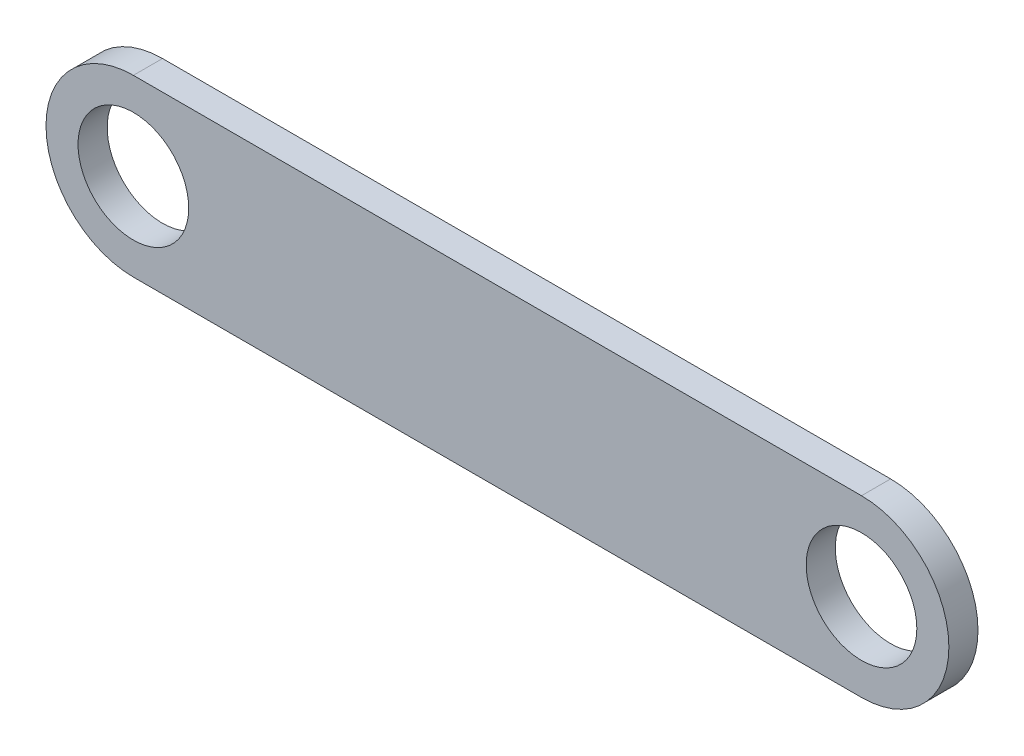
ISO-10303-21;
HEADER;
FILE_DESCRIPTION(('STEP AP214'),'2;1');
FILE_NAME('part.step','',(''),(''),'','','');
FILE_SCHEMA(('AUTOMOTIVE_DESIGN { 1 0 10303 214 1 1 1 1 }'));
ENDSEC;
DATA;
#1=APPLICATION_CONTEXT('core data for automotive mechanical design processes');
#2=APPLICATION_PROTOCOL_DEFINITION('international standard','automotive_design',2000,#1);
#3=PRODUCT_CONTEXT('',#1,'mechanical');
#4=PRODUCT('Part','Part','',(#3));
#5=PRODUCT_RELATED_PRODUCT_CATEGORY('part','',(#4));
#6=PRODUCT_DEFINITION_FORMATION('','',#4);
#7=PRODUCT_DEFINITION_CONTEXT('part definition',#1,'design');
#8=PRODUCT_DEFINITION('design','',#6,#7);
#9=PRODUCT_DEFINITION_SHAPE('','',#8);
#10=(LENGTH_UNIT() NAMED_UNIT(*) SI_UNIT(.MILLI.,.METRE.));
#11=(NAMED_UNIT(*) PLANE_ANGLE_UNIT() SI_UNIT($,.RADIAN.));
#12=(NAMED_UNIT(*) SI_UNIT($,.STERADIAN.) SOLID_ANGLE_UNIT());
#13=UNCERTAINTY_MEASURE_WITH_UNIT(LENGTH_MEASURE(1.E-05),#10,'distance_accuracy_value','');
#14=(GEOMETRIC_REPRESENTATION_CONTEXT(3) GLOBAL_UNCERTAINTY_ASSIGNED_CONTEXT((#13)) GLOBAL_UNIT_ASSIGNED_CONTEXT((#10,
#11,#12)) REPRESENTATION_CONTEXT('',''));
#15=CARTESIAN_POINT('',(0.,0.,0.));
#16=DIRECTION('',(0.,0.,1.));
#17=DIRECTION('',(1.,0.,0.));
#18=AXIS2_PLACEMENT_3D('',#15,#16,#17);
#19=CARTESIAN_POINT('',(0.,0.,5.));
#20=DIRECTION('',(0.,0.,1.));
#21=DIRECTION('',(1.,0.,0.));
#22=AXIS2_PLACEMENT_3D('',#19,#20,#21);
#23=PLANE('',#22);
#24=CARTESIAN_POINT('',(0.,0.,5.));
#25=DIRECTION('',(0.,0.,1.));
#26=DIRECTION('',(1.,0.,0.));
#27=AXIS2_PLACEMENT_3D('',#24,#25,#26);
#28=CIRCLE('',#27,9.5);
#29=CARTESIAN_POINT('',(9.5,0.,5.));
#30=VERTEX_POINT('',#29);
#31=EDGE_CURVE('E102',#30,#30,#28,.T.);
#32=ORIENTED_EDGE('',*,*,#31,.F.);
#33=EDGE_LOOP('',(#32));
#34=FACE_BOUND('',#33,.T.);
#35=CARTESIAN_POINT('',(0.,0.,5.));
#36=DIRECTION('',(0.,0.,1.));
#37=DIRECTION('',(1.,0.,0.));
#38=AXIS2_PLACEMENT_3D('',#35,#36,#37);
#39=CIRCLE('',#38,15.);
#40=CARTESIAN_POINT('',(0.,15.,5.));
#41=VERTEX_POINT('',#40);
#42=CARTESIAN_POINT('',(0.,-15.,5.));
#43=VERTEX_POINT('',#42);
#44=EDGE_CURVE('E87',#41,#43,#39,.T.);
#45=ORIENTED_EDGE('',*,*,#44,.T.);
#46=DIRECTION('',(1.,0.,0.));
#47=VECTOR('',#46,1.);
#48=CARTESIAN_POINT('',(0.,-15.,5.));
#49=LINE('',#48,#47);
#50=CARTESIAN_POINT('',(125.,-15.,5.));
#51=VERTEX_POINT('',#50);
#52=EDGE_CURVE('E82',#43,#51,#49,.T.);
#53=ORIENTED_EDGE('',*,*,#52,.T.);
#54=CARTESIAN_POINT('',(125.,0.,5.));
#55=DIRECTION('',(0.,0.,1.));
#56=DIRECTION('',(1.,0.,0.));
#57=AXIS2_PLACEMENT_3D('',#54,#55,#56);
#58=CIRCLE('',#57,15.);
#59=CARTESIAN_POINT('',(125.,15.,5.));
#60=VERTEX_POINT('',#59);
#61=EDGE_CURVE('E85',#51,#60,#58,.T.);
#62=ORIENTED_EDGE('',*,*,#61,.T.);
#63=DIRECTION('',(-1.,0.,0.));
#64=VECTOR('',#63,1.);
#65=CARTESIAN_POINT('',(0.,15.,5.));
#66=LINE('',#65,#64);
#67=EDGE_CURVE('E52',#60,#41,#66,.T.);
#68=ORIENTED_EDGE('',*,*,#67,.T.);
#69=EDGE_LOOP('',(#45,#53,#62,#68));
#70=FACE_BOUND('',#69,.T.);
#71=CARTESIAN_POINT('',(125.,0.,5.));
#72=DIRECTION('',(0.,0.,1.));
#73=DIRECTION('',(1.,0.,0.));
#74=AXIS2_PLACEMENT_3D('',#71,#72,#73);
#75=CIRCLE('',#74,9.50000000000001);
#76=CARTESIAN_POINT('',(134.5,0.,5.));
#77=VERTEX_POINT('',#76);
#78=EDGE_CURVE('E117',#77,#77,#75,.T.);
#79=ORIENTED_EDGE('',*,*,#78,.F.);
#80=EDGE_LOOP('',(#79));
#81=FACE_BOUND('',#80,.T.);
#82=ADVANCED_FACE('F35',(#34,#70,#81),#23,.T.);
#83=CARTESIAN_POINT('',(0.,0.,0.));
#84=DIRECTION('',(0.,0.,1.));
#85=DIRECTION('',(1.,0.,0.));
#86=AXIS2_PLACEMENT_3D('',#83,#84,#85);
#87=PLANE('',#86);
#88=CARTESIAN_POINT('',(0.,0.,0.));
#89=DIRECTION('',(0.,0.,1.));
#90=DIRECTION('',(1.,0.,0.));
#91=AXIS2_PLACEMENT_3D('',#88,#89,#90);
#92=CIRCLE('',#91,15.);
#93=CARTESIAN_POINT('',(0.,15.,0.));
#94=VERTEX_POINT('',#93);
#95=CARTESIAN_POINT('',(0.,-15.,0.));
#96=VERTEX_POINT('',#95);
#97=EDGE_CURVE('E99',#94,#96,#92,.T.);
#98=ORIENTED_EDGE('',*,*,#97,.F.);
#99=DIRECTION('',(-1.,0.,0.));
#100=VECTOR('',#99,1.);
#101=CARTESIAN_POINT('',(0.,15.,0.));
#102=LINE('',#101,#100);
#103=CARTESIAN_POINT('',(125.,15.,0.));
#104=VERTEX_POINT('',#103);
#105=EDGE_CURVE('E75',#104,#94,#102,.T.);
#106=ORIENTED_EDGE('',*,*,#105,.F.);
#107=CARTESIAN_POINT('',(125.,0.,0.));
#108=DIRECTION('',(0.,0.,1.));
#109=DIRECTION('',(1.,0.,0.));
#110=AXIS2_PLACEMENT_3D('',#107,#108,#109);
#111=CIRCLE('',#110,15.);
#112=CARTESIAN_POINT('',(125.,-15.,0.));
#113=VERTEX_POINT('',#112);
#114=EDGE_CURVE('E69',#113,#104,#111,.T.);
#115=ORIENTED_EDGE('',*,*,#114,.F.);
#116=DIRECTION('',(1.,0.,0.));
#117=VECTOR('',#116,1.);
#118=CARTESIAN_POINT('',(0.,-15.,0.));
#119=LINE('',#118,#117);
#120=EDGE_CURVE('E91',#96,#113,#119,.T.);
#121=ORIENTED_EDGE('',*,*,#120,.F.);
#122=EDGE_LOOP('',(#98,#106,#115,#121));
#123=FACE_BOUND('',#122,.T.);
#124=CARTESIAN_POINT('',(0.,0.,0.));
#125=DIRECTION('',(0.,0.,1.));
#126=DIRECTION('',(1.,0.,0.));
#127=AXIS2_PLACEMENT_3D('',#124,#125,#126);
#128=CIRCLE('',#127,9.5);
#129=CARTESIAN_POINT('',(9.5,0.,0.));
#130=VERTEX_POINT('',#129);
#131=EDGE_CURVE('E114',#130,#130,#128,.T.);
#132=ORIENTED_EDGE('',*,*,#131,.T.);
#133=EDGE_LOOP('',(#132));
#134=FACE_BOUND('',#133,.T.);
#135=CARTESIAN_POINT('',(125.,0.,0.));
#136=DIRECTION('',(0.,0.,1.));
#137=DIRECTION('',(1.,0.,0.));
#138=AXIS2_PLACEMENT_3D('',#135,#136,#137);
#139=CIRCLE('',#138,9.50000000000001);
#140=CARTESIAN_POINT('',(134.5,0.,0.));
#141=VERTEX_POINT('',#140);
#142=EDGE_CURVE('E120',#141,#141,#139,.T.);
#143=ORIENTED_EDGE('',*,*,#142,.T.);
#144=EDGE_LOOP('',(#143));
#145=FACE_BOUND('',#144,.T.);
#146=ADVANCED_FACE('F110',(#123,#134,#145),#87,.F.);
#147=CARTESIAN_POINT('',(0.,0.,5.));
#148=DIRECTION('',(0.,0.,-1.));
#149=DIRECTION('',(-1.,0.,0.));
#150=AXIS2_PLACEMENT_3D('',#147,#148,#149);
#151=CYLINDRICAL_SURFACE('',#150,15.);
#152=ORIENTED_EDGE('',*,*,#97,.T.);
#153=DIRECTION('',(0.,0.,-1.));
#154=VECTOR('',#153,1.);
#155=CARTESIAN_POINT('',(0.,-15.,5.));
#156=LINE('',#155,#154);
#157=EDGE_CURVE('E11',#43,#96,#156,.T.);
#158=ORIENTED_EDGE('',*,*,#157,.F.);
#159=ORIENTED_EDGE('',*,*,#44,.F.);
#160=DIRECTION('',(0.,0.,-1.));
#161=VECTOR('',#160,1.);
#162=CARTESIAN_POINT('',(0.,15.,5.));
#163=LINE('',#162,#161);
#164=EDGE_CURVE('E95',#41,#94,#163,.T.);
#165=ORIENTED_EDGE('',*,*,#164,.T.);
#166=EDGE_LOOP('',(#152,#158,#159,#165));
#167=FACE_BOUND('',#166,.T.);
#168=ADVANCED_FACE('F37',(#167),#151,.T.);
#169=CARTESIAN_POINT('',(0.,-15.,5.));
#170=DIRECTION('',(0.,1.,0.));
#171=DIRECTION('',(0.,0.,1.));
#172=AXIS2_PLACEMENT_3D('',#169,#170,#171);
#173=PLANE('',#172);
#174=ORIENTED_EDGE('',*,*,#120,.T.);
#175=DIRECTION('',(0.,0.,-1.));
#176=VECTOR('',#175,1.);
#177=CARTESIAN_POINT('',(125.,-15.,5.));
#178=LINE('',#177,#176);
#179=EDGE_CURVE('E44',#51,#113,#178,.T.);
#180=ORIENTED_EDGE('',*,*,#179,.F.);
#181=ORIENTED_EDGE('',*,*,#52,.F.);
#182=ORIENTED_EDGE('',*,*,#157,.T.);
#183=EDGE_LOOP('',(#174,#180,#181,#182));
#184=FACE_BOUND('',#183,.T.);
#185=ADVANCED_FACE('F90',(#184),#173,.F.);
#186=CARTESIAN_POINT('',(125.,0.,5.));
#187=DIRECTION('',(0.,0.,-1.));
#188=DIRECTION('',(-1.,0.,0.));
#189=AXIS2_PLACEMENT_3D('',#186,#187,#188);
#190=CYLINDRICAL_SURFACE('',#189,15.);
#191=ORIENTED_EDGE('',*,*,#114,.T.);
#192=DIRECTION('',(0.,0.,-1.));
#193=VECTOR('',#192,1.);
#194=CARTESIAN_POINT('',(125.,15.,5.));
#195=LINE('',#194,#193);
#196=EDGE_CURVE('E92',#60,#104,#195,.T.);
#197=ORIENTED_EDGE('',*,*,#196,.F.);
#198=ORIENTED_EDGE('',*,*,#61,.F.);
#199=ORIENTED_EDGE('',*,*,#179,.T.);
#200=EDGE_LOOP('',(#191,#197,#198,#199));
#201=FACE_BOUND('',#200,.T.);
#202=ADVANCED_FACE('F93',(#201),#190,.T.);
#203=CARTESIAN_POINT('',(0.,15.,5.));
#204=DIRECTION('',(0.,-1.,0.));
#205=DIRECTION('',(0.,0.,-1.));
#206=AXIS2_PLACEMENT_3D('',#203,#204,#205);
#207=PLANE('',#206);
#208=ORIENTED_EDGE('',*,*,#105,.T.);
#209=ORIENTED_EDGE('',*,*,#164,.F.);
#210=ORIENTED_EDGE('',*,*,#67,.F.);
#211=ORIENTED_EDGE('',*,*,#196,.T.);
#212=EDGE_LOOP('',(#208,#209,#210,#211));
#213=FACE_BOUND('',#212,.T.);
#214=ADVANCED_FACE('F107',(#213),#207,.F.);
#215=CARTESIAN_POINT('',(0.,0.,5.));
#216=DIRECTION('',(0.,0.,-1.));
#217=DIRECTION('',(-1.,0.,0.));
#218=AXIS2_PLACEMENT_3D('',#215,#216,#217);
#219=CYLINDRICAL_SURFACE('',#218,9.5);
#220=ORIENTED_EDGE('',*,*,#31,.T.);
#221=EDGE_LOOP('',(#220));
#222=FACE_BOUND('',#221,.T.);
#223=ORIENTED_EDGE('',*,*,#131,.F.);
#224=EDGE_LOOP('',(#223));
#225=FACE_BOUND('',#224,.T.);
#226=ADVANCED_FACE('F137',(#222,#225),#219,.F.);
#227=CARTESIAN_POINT('',(125.,0.,5.));
#228=DIRECTION('',(0.,0.,-1.));
#229=DIRECTION('',(-1.,0.,0.));
#230=AXIS2_PLACEMENT_3D('',#227,#228,#229);
#231=CYLINDRICAL_SURFACE('',#230,9.50000000000001);
#232=ORIENTED_EDGE('',*,*,#78,.T.);
#233=EDGE_LOOP('',(#232));
#234=FACE_BOUND('',#233,.T.);
#235=ORIENTED_EDGE('',*,*,#142,.F.);
#236=EDGE_LOOP('',(#235));
#237=FACE_BOUND('',#236,.T.);
#238=ADVANCED_FACE('F126',(#234,#237),#231,.F.);
#239=CLOSED_SHELL('',(#82,#146,#168,#185,#202,#214,#226,#238));
#240=MANIFOLD_SOLID_BREP('B2',#239);
#241=ADVANCED_BREP_SHAPE_REPRESENTATION('',(#18,#240),#14);
#242=SHAPE_DEFINITION_REPRESENTATION(#9,#241);
ENDSEC;
END-ISO-10303-21;
